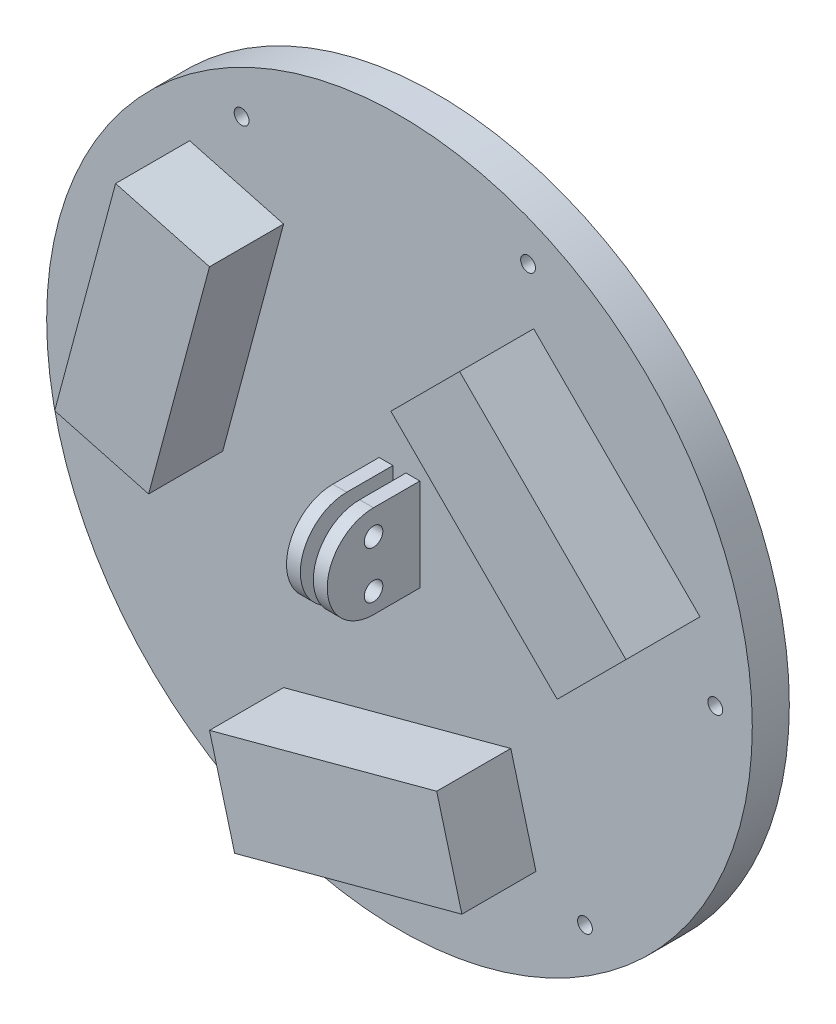
ISO-10303-21;
HEADER;
FILE_DESCRIPTION(('STEP AP214'),'2;1');
FILE_NAME('part.step','',(''),(''),'','','');
FILE_SCHEMA(('AUTOMOTIVE_DESIGN { 1 0 10303 214 1 1 1 1 }'));
ENDSEC;
DATA;
#1=APPLICATION_CONTEXT('core data for automotive mechanical design processes');
#2=APPLICATION_PROTOCOL_DEFINITION('international standard','automotive_design',2000,#1);
#3=PRODUCT_CONTEXT('',#1,'mechanical');
#4=PRODUCT('Part','Part','',(#3));
#5=PRODUCT_RELATED_PRODUCT_CATEGORY('part','',(#4));
#6=PRODUCT_DEFINITION_FORMATION('','',#4);
#7=PRODUCT_DEFINITION_CONTEXT('part definition',#1,'design');
#8=PRODUCT_DEFINITION('design','',#6,#7);
#9=PRODUCT_DEFINITION_SHAPE('','',#8);
#10=(LENGTH_UNIT() NAMED_UNIT(*) SI_UNIT(.MILLI.,.METRE.));
#11=(NAMED_UNIT(*) PLANE_ANGLE_UNIT() SI_UNIT($,.RADIAN.));
#12=(NAMED_UNIT(*) SI_UNIT($,.STERADIAN.) SOLID_ANGLE_UNIT());
#13=UNCERTAINTY_MEASURE_WITH_UNIT(LENGTH_MEASURE(1.E-05),#10,'distance_accuracy_value','');
#14=(GEOMETRIC_REPRESENTATION_CONTEXT(3) GLOBAL_UNCERTAINTY_ASSIGNED_CONTEXT((#13)) GLOBAL_UNIT_ASSIGNED_CONTEXT((#10,
#11,#12)) REPRESENTATION_CONTEXT('',''));
#15=CARTESIAN_POINT('',(0.,0.,0.));
#16=DIRECTION('',(0.,0.,1.));
#17=DIRECTION('',(1.,0.,0.));
#18=AXIS2_PLACEMENT_3D('',#15,#16,#17);
#19=CARTESIAN_POINT('',(0.,0.,4.));
#20=DIRECTION('',(0.,0.,1.));
#21=DIRECTION('',(1.,0.,0.));
#22=AXIS2_PLACEMENT_3D('',#19,#20,#21);
#23=PLANE('',#22);
#24=CARTESIAN_POINT('',(13.8867658683062,31.1443049965615,4.));
#25=DIRECTION('',(0.,0.,1.));
#26=DIRECTION('',(1.,0.,0.));
#27=AXIS2_PLACEMENT_3D('',#24,#25,#26);
#28=CIRCLE('',#27,0.800000000000001);
#29=CARTESIAN_POINT('',(14.6867658683062,31.1443049965615,4.));
#30=VERTEX_POINT('',#29);
#31=EDGE_CURVE('E922',#30,#30,#28,.T.);
#32=ORIENTED_EDGE('',*,*,#31,.F.);
#33=EDGE_LOOP('',(#32));
#34=FACE_BOUND('',#33,.T.);
#35=CARTESIAN_POINT('',(20.0283763760814,-27.5984445166405,4.));
#36=DIRECTION('',(0.,0.,1.));
#37=DIRECTION('',(1.,0.,0.));
#38=AXIS2_PLACEMENT_3D('',#35,#36,#37);
#39=CIRCLE('',#38,0.800000000000637);
#40=CARTESIAN_POINT('',(20.828376376082,-27.5984445166405,4.));
#41=VERTEX_POINT('',#40);
#42=EDGE_CURVE('E924',#41,#41,#39,.T.);
#43=ORIENTED_EDGE('',*,*,#42,.F.);
#44=EDGE_LOOP('',(#43));
#45=FACE_BOUND('',#44,.T.);
#46=CARTESIAN_POINT('',(-33.9151422443851,-3.54586047992216,4.));
#47=DIRECTION('',(0.,0.,1.));
#48=DIRECTION('',(1.,0.,0.));
#49=AXIS2_PLACEMENT_3D('',#46,#47,#48);
#50=CIRCLE('',#49,0.800000000001796);
#51=CARTESIAN_POINT('',(-33.1151422443833,-3.54586047992216,4.));
#52=VERTEX_POINT('',#51);
#53=EDGE_CURVE('E935',#52,#52,#50,.T.);
#54=ORIENTED_EDGE('',*,*,#53,.F.);
#55=EDGE_LOOP('',(#54));
#56=FACE_BOUND('',#55,.T.);
#57=CARTESIAN_POINT('',(0.,0.,4.));
#58=DIRECTION('',(0.,0.,1.));
#59=DIRECTION('',(1.,0.,0.));
#60=AXIS2_PLACEMENT_3D('',#57,#58,#59);
#61=CIRCLE('',#60,0.6);
#62=CARTESIAN_POINT('',(0.6,0.,4.));
#63=VERTEX_POINT('',#62);
#64=EDGE_CURVE('E408',#63,#63,#61,.T.);
#65=ORIENTED_EDGE('',*,*,#64,.F.);
#66=EDGE_LOOP('',(#65));
#67=FACE_BOUND('',#66,.T.);
#68=CARTESIAN_POINT('',(34.1000000000013,-0.0857218150126376,4.));
#69=DIRECTION('',(0.,0.,1.));
#70=DIRECTION('',(1.,0.,0.));
#71=AXIS2_PLACEMENT_3D('',#68,#69,#70);
#72=CIRCLE('',#71,0.800000000000003);
#73=CARTESIAN_POINT('',(34.9000000000013,-0.0857218150126376,4.));
#74=VERTEX_POINT('',#73);
#75=EDGE_CURVE('E413',#74,#74,#72,.T.);
#76=ORIENTED_EDGE('',*,*,#75,.F.);
#77=EDGE_LOOP('',(#76));
#78=FACE_BOUND('',#77,.T.);
#79=CARTESIAN_POINT('',(-17.0499999999986,-29.617188084062,4.));
#80=DIRECTION('',(0.,0.,1.));
#81=DIRECTION('',(1.,0.,0.));
#82=AXIS2_PLACEMENT_3D('',#79,#80,#81);
#83=CIRCLE('',#82,0.799999999999999);
#84=CARTESIAN_POINT('',(-16.2499999999986,-29.617188084062,4.));
#85=VERTEX_POINT('',#84);
#86=EDGE_CURVE('E418',#85,#85,#83,.T.);
#87=ORIENTED_EDGE('',*,*,#86,.F.);
#88=EDGE_LOOP('',(#87));
#89=FACE_BOUND('',#88,.T.);
#90=CARTESIAN_POINT('',(-17.0499999999987,29.4457444540367,4.));
#91=DIRECTION('',(0.,0.,1.));
#92=DIRECTION('',(1.,0.,0.));
#93=AXIS2_PLACEMENT_3D('',#90,#91,#92);
#94=CIRCLE('',#93,0.799999999999999);
#95=CARTESIAN_POINT('',(-16.2499999999986,29.4457444540367,4.));
#96=VERTEX_POINT('',#95);
#97=EDGE_CURVE('E422',#96,#96,#94,.T.);
#98=ORIENTED_EDGE('',*,*,#97,.F.);
#99=EDGE_LOOP('',(#98));
#100=FACE_BOUND('',#99,.T.);
#101=CARTESIAN_POINT('',(0.,0.,4.));
#102=DIRECTION('',(0.,0.,1.));
#103=DIRECTION('',(1.,0.,0.));
#104=AXIS2_PLACEMENT_3D('',#101,#102,#103);
#105=CIRCLE('',#104,38.1);
#106=CARTESIAN_POINT('',(38.1,0.,4.));
#107=VERTEX_POINT('',#106);
#108=EDGE_CURVE('E11',#107,#107,#105,.T.);
#109=ORIENTED_EDGE('',*,*,#108,.T.);
#110=EDGE_LOOP('',(#109));
#111=FACE_BOUND('',#110,.T.);
#112=DIRECTION('',(1.,0.,0.));
#113=VECTOR('',#112,1.);
#114=CARTESIAN_POINT('',(0.7,-5.,4.));
#115=LINE('',#114,#113);
#116=CARTESIAN_POINT('',(0.7,-5.,4.));
#117=VERTEX_POINT('',#116);
#118=CARTESIAN_POINT('',(2.2,-5.,4.));
#119=VERTEX_POINT('',#118);
#120=EDGE_CURVE('E384',#117,#119,#115,.T.);
#121=ORIENTED_EDGE('',*,*,#120,.F.);
#122=DIRECTION('',(0.,-1.,0.));
#123=VECTOR('',#122,1.);
#124=CARTESIAN_POINT('',(0.699999999999999,5.,4.));
#125=LINE('',#124,#123);
#126=CARTESIAN_POINT('',(0.699999999999999,5.,4.));
#127=VERTEX_POINT('',#126);
#128=EDGE_CURVE('E380',#127,#117,#125,.T.);
#129=ORIENTED_EDGE('',*,*,#128,.F.);
#130=DIRECTION('',(-1.,0.,0.));
#131=VECTOR('',#130,1.);
#132=CARTESIAN_POINT('',(0.699999999999999,5.,4.));
#133=LINE('',#132,#131);
#134=CARTESIAN_POINT('',(2.2,5.,4.));
#135=VERTEX_POINT('',#134);
#136=EDGE_CURVE('E392',#135,#127,#133,.T.);
#137=ORIENTED_EDGE('',*,*,#136,.F.);
#138=DIRECTION('',(0.,1.,0.));
#139=VECTOR('',#138,1.);
#140=CARTESIAN_POINT('',(2.2,5.,4.));
#141=LINE('',#140,#139);
#142=EDGE_CURVE('E388',#119,#135,#141,.T.);
#143=ORIENTED_EDGE('',*,*,#142,.F.);
#144=EDGE_LOOP('',(#121,#129,#137,#143));
#145=FACE_BOUND('',#144,.T.);
#146=DIRECTION('',(-1.,0.,0.));
#147=VECTOR('',#146,1.);
#148=CARTESIAN_POINT('',(-0.700000000000001,5.,4.));
#149=LINE('',#148,#147);
#150=CARTESIAN_POINT('',(-0.700000000000001,5.,4.));
#151=VERTEX_POINT('',#150);
#152=CARTESIAN_POINT('',(-2.2,5.,4.));
#153=VERTEX_POINT('',#152);
#154=EDGE_CURVE('E372',#151,#153,#149,.T.);
#155=ORIENTED_EDGE('',*,*,#154,.F.);
#156=DIRECTION('',(0.,1.,0.));
#157=VECTOR('',#156,1.);
#158=CARTESIAN_POINT('',(-0.700000000000001,5.,4.));
#159=LINE('',#158,#157);
#160=CARTESIAN_POINT('',(-0.7,-5.,4.));
#161=VERTEX_POINT('',#160);
#162=EDGE_CURVE('E376',#161,#151,#159,.T.);
#163=ORIENTED_EDGE('',*,*,#162,.F.);
#164=DIRECTION('',(1.,0.,0.));
#165=VECTOR('',#164,1.);
#166=CARTESIAN_POINT('',(-0.7,-5.,4.));
#167=LINE('',#166,#165);
#168=CARTESIAN_POINT('',(-2.2,-5.,4.));
#169=VERTEX_POINT('',#168);
#170=EDGE_CURVE('E364',#169,#161,#167,.T.);
#171=ORIENTED_EDGE('',*,*,#170,.F.);
#172=DIRECTION('',(0.,-1.,0.));
#173=VECTOR('',#172,1.);
#174=CARTESIAN_POINT('',(-2.2,5.,4.));
#175=LINE('',#174,#173);
#176=EDGE_CURVE('E368',#153,#169,#175,.T.);
#177=ORIENTED_EDGE('',*,*,#176,.F.);
#178=EDGE_LOOP('',(#155,#163,#171,#177));
#179=FACE_BOUND('',#178,.T.);
#180=DIRECTION('',(0.707106781186546,0.707106781186549,0.));
#181=VECTOR('',#180,1.);
#182=CARTESIAN_POINT('',(25.0287924547002,0.,4.));
#183=LINE('',#182,#181);
#184=CARTESIAN_POINT('',(25.0287924547002,0.,4.));
#185=VERTEX_POINT('',#184);
#186=CARTESIAN_POINT('',(32.4534136571589,7.42462120245876,4.));
#187=VERTEX_POINT('',#186);
#188=EDGE_CURVE('E281',#185,#187,#183,.T.);
#189=ORIENTED_EDGE('',*,*,#188,.F.);
#190=DIRECTION('',(0.707106781186549,-0.707106781186546,0.));
#191=VECTOR('',#190,1.);
#192=CARTESIAN_POINT('',(25.0287924547002,0.,4.));
#193=LINE('',#192,#191);
#194=CARTESIAN_POINT('',(7.06828021256182,17.9605122421383,4.));
#195=VERTEX_POINT('',#194);
#196=EDGE_CURVE('E251',#195,#185,#193,.T.);
#197=ORIENTED_EDGE('',*,*,#196,.F.);
#198=DIRECTION('',(-0.707106781186546,-0.707106781186549,0.));
#199=VECTOR('',#198,1.);
#200=CARTESIAN_POINT('',(7.06828021256182,17.9605122421383,4.));
#201=LINE('',#200,#199);
#202=CARTESIAN_POINT('',(14.4929014150206,25.385133444597,4.));
#203=VERTEX_POINT('',#202);
#204=EDGE_CURVE('E268',#203,#195,#201,.T.);
#205=ORIENTED_EDGE('',*,*,#204,.F.);
#206=DIRECTION('',(-0.707106781186549,0.707106781186546,0.));
#207=VECTOR('',#206,1.);
#208=CARTESIAN_POINT('',(32.4534136571589,7.42462120245876,4.));
#209=LINE('',#208,#207);
#210=EDGE_CURVE('E284',#187,#203,#209,.T.);
#211=ORIENTED_EDGE('',*,*,#210,.F.);
#212=EDGE_LOOP('',(#189,#197,#205,#211));
#213=FACE_BOUND('',#212,.T.);
#214=DIRECTION('',(0.258819045102518,-0.965925826289069,0.));
#215=VECTOR('',#214,1.);
#216=CARTESIAN_POINT('',(-12.5143962273502,-21.6755700918186,4.));
#217=LINE('',#216,#215);
#218=CARTESIAN_POINT('',(-12.5143962273502,-21.6755700918186,4.));
#219=VERTEX_POINT('',#218);
#220=CARTESIAN_POINT('',(-9.79679625377374,-31.8177912678538,4.));
#221=VERTEX_POINT('',#220);
#222=EDGE_CURVE('E244',#219,#221,#217,.T.);
#223=ORIENTED_EDGE('',*,*,#222,.F.);
#224=DIRECTION('',(-0.965925826289069,-0.258819045102518,0.));
#225=VECTOR('',#224,1.);
#226=CARTESIAN_POINT('',(-12.5143962273502,-21.6755700918186,4.));
#227=LINE('',#226,#225);
#228=CARTESIAN_POINT('',(12.0201197603922,-15.1015663462146,4.));
#229=VERTEX_POINT('',#228);
#230=EDGE_CURVE('E247',#229,#219,#227,.T.);
#231=ORIENTED_EDGE('',*,*,#230,.F.);
#232=DIRECTION('',(-0.258819045102518,0.965925826289069,0.));
#233=VECTOR('',#232,1.);
#234=CARTESIAN_POINT('',(12.0201197603922,-15.1015663462146,4.));
#235=LINE('',#234,#233);
#236=CARTESIAN_POINT('',(14.7377197339686,-25.2437875222498,4.));
#237=VERTEX_POINT('',#236);
#238=EDGE_CURVE('E237',#237,#229,#235,.T.);
#239=ORIENTED_EDGE('',*,*,#238,.F.);
#240=DIRECTION('',(0.965925826289069,0.258819045102518,0.));
#241=VECTOR('',#240,1.);
#242=CARTESIAN_POINT('',(-9.79679625377374,-31.8177912678538,4.));
#243=LINE('',#242,#241);
#244=EDGE_CURVE('E240',#221,#237,#243,.T.);
#245=ORIENTED_EDGE('',*,*,#244,.F.);
#246=EDGE_LOOP('',(#223,#231,#239,#245));
#247=FACE_BOUND('',#246,.T.);
#248=DIRECTION('',(-0.965925826289066,0.258819045102528,0.));
#249=VECTOR('',#248,1.);
#250=CARTESIAN_POINT('',(-12.5143962273499,21.6755700918187,4.));
#251=LINE('',#250,#249);
#252=CARTESIAN_POINT('',(-12.5143962273499,21.6755700918187,4.));
#253=VERTEX_POINT('',#252);
#254=CARTESIAN_POINT('',(-22.6566174033851,24.3931700653953,4.));
#255=VERTEX_POINT('',#254);
#256=EDGE_CURVE('E206',#253,#255,#251,.T.);
#257=ORIENTED_EDGE('',*,*,#256,.F.);
#258=DIRECTION('',(0.258819045102528,0.965925826289066,0.));
#259=VECTOR('',#258,1.);
#260=CARTESIAN_POINT('',(-12.5143962273499,21.6755700918187,4.));
#261=LINE('',#260,#259);
#262=CARTESIAN_POINT('',(-19.0883999729541,-2.85894589592355,4.));
#263=VERTEX_POINT('',#262);
#264=EDGE_CURVE('E200',#263,#253,#261,.T.);
#265=ORIENTED_EDGE('',*,*,#264,.F.);
#266=DIRECTION('',(0.965925826289066,-0.258819045102528,0.));
#267=VECTOR('',#266,1.);
#268=CARTESIAN_POINT('',(-19.0883999729541,-2.85894589592355,4.));
#269=LINE('',#268,#267);
#270=CARTESIAN_POINT('',(-29.2306211489893,-0.141345922347008,4.));
#271=VERTEX_POINT('',#270);
#272=EDGE_CURVE('E184',#271,#263,#269,.T.);
#273=ORIENTED_EDGE('',*,*,#272,.F.);
#274=DIRECTION('',(-0.258819045102528,-0.965925826289066,0.));
#275=VECTOR('',#274,1.);
#276=CARTESIAN_POINT('',(-22.6566174033851,24.3931700653953,4.));
#277=LINE('',#276,#275);
#278=EDGE_CURVE('E193',#255,#271,#277,.T.);
#279=ORIENTED_EDGE('',*,*,#278,.F.);
#280=EDGE_LOOP('',(#257,#265,#273,#279));
#281=FACE_BOUND('',#280,.T.);
#282=ADVANCED_FACE('F43',(#34,#45,#56,#67,#78,#89,#100,#111,#145,#179,#213,#247,#281),#23,.T.);
#283=CARTESIAN_POINT('',(0.699999999999999,5.,14.));
#284=DIRECTION('',(1.,0.,0.));
#285=DIRECTION('',(0.,1.,0.));
#286=AXIS2_PLACEMENT_3D('',#283,#284,#285);
#287=PLANE('',#286);
#288=CARTESIAN_POINT('',(0.699999999999999,2.3,9.));
#289=DIRECTION('',(1.,0.,0.));
#290=DIRECTION('',(0.,1.,0.));
#291=AXIS2_PLACEMENT_3D('',#288,#289,#290);
#292=CIRCLE('',#291,1.);
#293=CARTESIAN_POINT('',(0.699999999999999,3.3,9.));
#294=VERTEX_POINT('',#293);
#295=EDGE_CURVE('E324',#294,#294,#292,.T.);
#296=ORIENTED_EDGE('',*,*,#295,.T.);
#297=EDGE_LOOP('',(#296));
#298=FACE_BOUND('',#297,.T.);
#299=CARTESIAN_POINT('',(0.699999999999999,-2.8,9.));
#300=DIRECTION('',(1.,0.,0.));
#301=DIRECTION('',(0.,1.,0.));
#302=AXIS2_PLACEMENT_3D('',#299,#300,#301);
#303=CIRCLE('',#302,1.);
#304=CARTESIAN_POINT('',(0.699999999999999,-1.8,9.));
#305=VERTEX_POINT('',#304);
#306=EDGE_CURVE('E316',#305,#305,#303,.T.);
#307=ORIENTED_EDGE('',*,*,#306,.T.);
#308=EDGE_LOOP('',(#307));
#309=FACE_BOUND('',#308,.T.);
#310=DIRECTION('',(0.,0.,-1.));
#311=VECTOR('',#310,1.);
#312=CARTESIAN_POINT('',(0.7,-5.,14.));
#313=LINE('',#312,#311);
#314=CARTESIAN_POINT('',(0.699999999999999,-5.,9.));
#315=VERTEX_POINT('',#314);
#316=EDGE_CURVE('E405',#315,#117,#313,.T.);
#317=ORIENTED_EDGE('',*,*,#316,.F.);
#318=CARTESIAN_POINT('',(0.699999999999999,0.,9.));
#319=DIRECTION('',(1.,0.,0.));
#320=DIRECTION('',(0.,1.,0.));
#321=AXIS2_PLACEMENT_3D('',#318,#319,#320);
#322=CIRCLE('',#321,5.);
#323=CARTESIAN_POINT('',(0.699999999999999,5.,9.));
#324=VERTEX_POINT('',#323);
#325=EDGE_CURVE('E348',#315,#324,#322,.F.);
#326=ORIENTED_EDGE('',*,*,#325,.T.);
#327=DIRECTION('',(0.,0.,-1.));
#328=VECTOR('',#327,1.);
#329=CARTESIAN_POINT('',(0.699999999999999,5.,14.));
#330=LINE('',#329,#328);
#331=EDGE_CURVE('E396',#324,#127,#330,.T.);
#332=ORIENTED_EDGE('',*,*,#331,.T.);
#333=ORIENTED_EDGE('',*,*,#128,.T.);
#334=EDGE_LOOP('',(#317,#326,#332,#333));
#335=FACE_BOUND('',#334,.T.);
#336=ADVANCED_FACE('F504',(#298,#309,#335),#287,.F.);
#337=CARTESIAN_POINT('',(2.2,5.,14.));
#338=DIRECTION('',(-1.,0.,0.));
#339=DIRECTION('',(0.,0.,1.));
#340=AXIS2_PLACEMENT_3D('',#337,#338,#339);
#341=PLANE('',#340);
#342=CARTESIAN_POINT('',(2.2,2.3,9.));
#343=DIRECTION('',(1.,0.,0.));
#344=DIRECTION('',(0.,1.,0.));
#345=AXIS2_PLACEMENT_3D('',#342,#343,#344);
#346=CIRCLE('',#345,1.);
#347=CARTESIAN_POINT('',(2.2,3.3,9.));
#348=VERTEX_POINT('',#347);
#349=EDGE_CURVE('E304',#348,#348,#346,.T.);
#350=ORIENTED_EDGE('',*,*,#349,.F.);
#351=EDGE_LOOP('',(#350));
#352=FACE_BOUND('',#351,.T.);
#353=CARTESIAN_POINT('',(2.2,-2.8,9.));
#354=DIRECTION('',(1.,0.,0.));
#355=DIRECTION('',(0.,1.,0.));
#356=AXIS2_PLACEMENT_3D('',#353,#354,#355);
#357=CIRCLE('',#356,1.);
#358=CARTESIAN_POINT('',(2.2,-1.8,9.));
#359=VERTEX_POINT('',#358);
#360=EDGE_CURVE('E303',#359,#359,#357,.T.);
#361=ORIENTED_EDGE('',*,*,#360,.F.);
#362=EDGE_LOOP('',(#361));
#363=FACE_BOUND('',#362,.T.);
#364=CARTESIAN_POINT('',(2.2,0.,9.));
#365=DIRECTION('',(1.,0.,0.));
#366=DIRECTION('',(0.,1.,0.));
#367=AXIS2_PLACEMENT_3D('',#364,#365,#366);
#368=CIRCLE('',#367,5.);
#369=CARTESIAN_POINT('',(2.2,-5.,9.));
#370=VERTEX_POINT('',#369);
#371=CARTESIAN_POINT('',(2.2,5.,9.));
#372=VERTEX_POINT('',#371);
#373=EDGE_CURVE('E333',#370,#372,#368,.F.);
#374=ORIENTED_EDGE('',*,*,#373,.F.);
#375=DIRECTION('',(0.,0.,-1.));
#376=VECTOR('',#375,1.);
#377=CARTESIAN_POINT('',(2.2,-5.,14.));
#378=LINE('',#377,#376);
#379=EDGE_CURVE('E402',#370,#119,#378,.T.);
#380=ORIENTED_EDGE('',*,*,#379,.T.);
#381=ORIENTED_EDGE('',*,*,#142,.T.);
#382=DIRECTION('',(0.,0.,-1.));
#383=VECTOR('',#382,1.);
#384=CARTESIAN_POINT('',(2.2,5.,14.));
#385=LINE('',#384,#383);
#386=EDGE_CURVE('E399',#372,#135,#385,.T.);
#387=ORIENTED_EDGE('',*,*,#386,.F.);
#388=EDGE_LOOP('',(#374,#380,#381,#387));
#389=FACE_BOUND('',#388,.T.);
#390=ADVANCED_FACE('F461',(#352,#363,#389),#341,.F.);
#391=CARTESIAN_POINT('',(-0.700000000000001,5.,14.));
#392=DIRECTION('',(-1.,0.,0.));
#393=DIRECTION('',(0.,-1.,0.));
#394=AXIS2_PLACEMENT_3D('',#391,#392,#393);
#395=PLANE('',#394);
#396=CARTESIAN_POINT('',(-0.699999999999999,2.3,9.));
#397=DIRECTION('',(-1.,0.,0.));
#398=DIRECTION('',(0.,-1.,0.));
#399=AXIS2_PLACEMENT_3D('',#396,#397,#398);
#400=CIRCLE('',#399,1.);
#401=CARTESIAN_POINT('',(-0.699999999999999,1.3,9.));
#402=VERTEX_POINT('',#401);
#403=EDGE_CURVE('E320',#402,#402,#400,.T.);
#404=ORIENTED_EDGE('',*,*,#403,.T.);
#405=EDGE_LOOP('',(#404));
#406=FACE_BOUND('',#405,.T.);
#407=CARTESIAN_POINT('',(-0.699999999999999,-2.8,9.));
#408=DIRECTION('',(-1.,0.,0.));
#409=DIRECTION('',(0.,-1.,0.));
#410=AXIS2_PLACEMENT_3D('',#407,#408,#409);
#411=CIRCLE('',#410,1.);
#412=CARTESIAN_POINT('',(-0.699999999999999,-3.8,9.));
#413=VERTEX_POINT('',#412);
#414=EDGE_CURVE('E312',#413,#413,#411,.T.);
#415=ORIENTED_EDGE('',*,*,#414,.T.);
#416=EDGE_LOOP('',(#415));
#417=FACE_BOUND('',#416,.T.);
#418=CARTESIAN_POINT('',(-0.699999999999999,0.,9.));
#419=DIRECTION('',(-1.,0.,0.));
#420=DIRECTION('',(0.,-1.,0.));
#421=AXIS2_PLACEMENT_3D('',#418,#419,#420);
#422=CIRCLE('',#421,5.);
#423=CARTESIAN_POINT('',(-0.699999999999999,5.,9.));
#424=VERTEX_POINT('',#423);
#425=CARTESIAN_POINT('',(-0.699999999999999,-5.,9.));
#426=VERTEX_POINT('',#425);
#427=EDGE_CURVE('E345',#424,#426,#422,.F.);
#428=ORIENTED_EDGE('',*,*,#427,.T.);
#429=DIRECTION('',(0.,0.,-1.));
#430=VECTOR('',#429,1.);
#431=CARTESIAN_POINT('',(-0.7,-5.,14.));
#432=LINE('',#431,#430);
#433=EDGE_CURVE('E361',#426,#161,#432,.T.);
#434=ORIENTED_EDGE('',*,*,#433,.T.);
#435=ORIENTED_EDGE('',*,*,#162,.T.);
#436=DIRECTION('',(0.,0.,-1.));
#437=VECTOR('',#436,1.);
#438=CARTESIAN_POINT('',(-0.700000000000001,5.,14.));
#439=LINE('',#438,#437);
#440=EDGE_CURVE('E352',#424,#151,#439,.T.);
#441=ORIENTED_EDGE('',*,*,#440,.F.);
#442=EDGE_LOOP('',(#428,#434,#435,#441));
#443=FACE_BOUND('',#442,.T.);
#444=ADVANCED_FACE('F458',(#406,#417,#443),#395,.F.);
#445=CARTESIAN_POINT('',(-2.2,5.,14.));
#446=DIRECTION('',(1.,0.,0.));
#447=DIRECTION('',(0.,1.,0.));
#448=AXIS2_PLACEMENT_3D('',#445,#446,#447);
#449=PLANE('',#448);
#450=CARTESIAN_POINT('',(-2.2,2.3,9.));
#451=DIRECTION('',(1.,0.,0.));
#452=DIRECTION('',(0.,1.,0.));
#453=AXIS2_PLACEMENT_3D('',#450,#451,#452);
#454=CIRCLE('',#453,1.);
#455=CARTESIAN_POINT('',(-2.2,3.3,9.));
#456=VERTEX_POINT('',#455);
#457=EDGE_CURVE('E47',#456,#456,#454,.T.);
#458=ORIENTED_EDGE('',*,*,#457,.T.);
#459=EDGE_LOOP('',(#458));
#460=FACE_BOUND('',#459,.T.);
#461=CARTESIAN_POINT('',(-2.2,-2.8,9.));
#462=DIRECTION('',(1.,0.,0.));
#463=DIRECTION('',(0.,1.,0.));
#464=AXIS2_PLACEMENT_3D('',#461,#462,#463);
#465=CIRCLE('',#464,1.);
#466=CARTESIAN_POINT('',(-2.2,-1.8,9.));
#467=VERTEX_POINT('',#466);
#468=EDGE_CURVE('E308',#467,#467,#465,.T.);
#469=ORIENTED_EDGE('',*,*,#468,.T.);
#470=EDGE_LOOP('',(#469));
#471=FACE_BOUND('',#470,.T.);
#472=DIRECTION('',(0.,0.,-1.));
#473=VECTOR('',#472,1.);
#474=CARTESIAN_POINT('',(-2.2,-5.,14.));
#475=LINE('',#474,#473);
#476=CARTESIAN_POINT('',(-2.2,-5.,9.));
#477=VERTEX_POINT('',#476);
#478=EDGE_CURVE('E358',#477,#169,#475,.T.);
#479=ORIENTED_EDGE('',*,*,#478,.F.);
#480=CARTESIAN_POINT('',(-2.2,0.,9.));
#481=DIRECTION('',(1.,0.,0.));
#482=DIRECTION('',(0.,1.,0.));
#483=AXIS2_PLACEMENT_3D('',#480,#481,#482);
#484=CIRCLE('',#483,5.);
#485=CARTESIAN_POINT('',(-2.2,5.,9.));
#486=VERTEX_POINT('',#485);
#487=EDGE_CURVE('E341',#477,#486,#484,.F.);
#488=ORIENTED_EDGE('',*,*,#487,.T.);
#489=DIRECTION('',(0.,0.,-1.));
#490=VECTOR('',#489,1.);
#491=CARTESIAN_POINT('',(-2.2,5.,14.));
#492=LINE('',#491,#490);
#493=EDGE_CURVE('E355',#486,#153,#492,.T.);
#494=ORIENTED_EDGE('',*,*,#493,.T.);
#495=ORIENTED_EDGE('',*,*,#176,.T.);
#496=EDGE_LOOP('',(#479,#488,#494,#495));
#497=FACE_BOUND('',#496,.T.);
#498=ADVANCED_FACE('F446',(#460,#471,#497),#449,.F.);
#499=CARTESIAN_POINT('',(0.699999999999999,5.,14.));
#500=DIRECTION('',(0.,-1.,0.));
#501=DIRECTION('',(0.,0.,-1.));
#502=AXIS2_PLACEMENT_3D('',#499,#500,#501);
#503=PLANE('',#502);
#504=DIRECTION('',(1.,0.,0.));
#505=VECTOR('',#504,1.);
#506=CARTESIAN_POINT('',(-38.1,4.99999999999999,9.));
#507=LINE('',#506,#505);
#508=EDGE_CURVE('E336',#324,#372,#507,.T.);
#509=ORIENTED_EDGE('',*,*,#508,.T.);
#510=ORIENTED_EDGE('',*,*,#386,.T.);
#511=ORIENTED_EDGE('',*,*,#136,.T.);
#512=ORIENTED_EDGE('',*,*,#331,.F.);
#513=EDGE_LOOP('',(#509,#510,#511,#512));
#514=FACE_BOUND('',#513,.T.);
#515=ADVANCED_FACE('F571',(#514),#503,.F.);
#516=CARTESIAN_POINT('',(-0.700000000000001,5.,14.));
#517=DIRECTION('',(0.,-1.,0.));
#518=DIRECTION('',(0.,0.,-1.));
#519=AXIS2_PLACEMENT_3D('',#516,#517,#518);
#520=PLANE('',#519);
#521=EDGE_CURVE('E340',#486,#424,#507,.T.);
#522=ORIENTED_EDGE('',*,*,#521,.T.);
#523=ORIENTED_EDGE('',*,*,#440,.T.);
#524=ORIENTED_EDGE('',*,*,#154,.T.);
#525=ORIENTED_EDGE('',*,*,#493,.F.);
#526=EDGE_LOOP('',(#522,#523,#524,#525));
#527=FACE_BOUND('',#526,.T.);
#528=ADVANCED_FACE('F483',(#527),#520,.F.);
#529=CARTESIAN_POINT('',(0.,0.,4.));
#530=DIRECTION('',(0.,0.,-1.));
#531=DIRECTION('',(-1.,0.,0.));
#532=AXIS2_PLACEMENT_3D('',#529,#530,#531);
#533=CYLINDRICAL_SURFACE('',#532,38.1);
#534=ORIENTED_EDGE('',*,*,#108,.F.);
#535=EDGE_LOOP('',(#534));
#536=FACE_BOUND('',#535,.T.);
#537=CARTESIAN_POINT('',(0.,0.,0.));
#538=DIRECTION('',(0.,0.,1.));
#539=DIRECTION('',(1.,0.,0.));
#540=AXIS2_PLACEMENT_3D('',#537,#538,#539);
#541=CIRCLE('',#540,38.1);
#542=CARTESIAN_POINT('',(38.1,0.,0.));
#543=VERTEX_POINT('',#542);
#544=EDGE_CURVE('E53',#543,#543,#541,.T.);
#545=ORIENTED_EDGE('',*,*,#544,.T.);
#546=EDGE_LOOP('',(#545));
#547=FACE_BOUND('',#546,.T.);
#548=ADVANCED_FACE('F45',(#536,#547),#533,.T.);
#549=CARTESIAN_POINT('',(0.,0.,0.));
#550=DIRECTION('',(0.,0.,1.));
#551=DIRECTION('',(1.,0.,0.));
#552=AXIS2_PLACEMENT_3D('',#549,#550,#551);
#553=PLANE('',#552);
#554=CARTESIAN_POINT('',(13.8867658683062,31.1443049965615,0.));
#555=DIRECTION('',(0.,0.,1.));
#556=DIRECTION('',(1.,0.,0.));
#557=AXIS2_PLACEMENT_3D('',#554,#555,#556);
#558=CIRCLE('',#557,0.800000000000001);
#559=CARTESIAN_POINT('',(14.6867658683062,31.1443049965615,0.));
#560=VERTEX_POINT('',#559);
#561=EDGE_CURVE('E530',#560,#560,#558,.T.);
#562=ORIENTED_EDGE('',*,*,#561,.T.);
#563=EDGE_LOOP('',(#562));
#564=FACE_BOUND('',#563,.T.);
#565=CARTESIAN_POINT('',(20.0283763760814,-27.5984445166405,0.));
#566=DIRECTION('',(0.,0.,1.));
#567=DIRECTION('',(1.,0.,0.));
#568=AXIS2_PLACEMENT_3D('',#565,#566,#567);
#569=CIRCLE('',#568,0.800000000000637);
#570=CARTESIAN_POINT('',(20.828376376082,-27.5984445166405,0.));
#571=VERTEX_POINT('',#570);
#572=EDGE_CURVE('E534',#571,#571,#569,.T.);
#573=ORIENTED_EDGE('',*,*,#572,.T.);
#574=EDGE_LOOP('',(#573));
#575=FACE_BOUND('',#574,.T.);
#576=CARTESIAN_POINT('',(-33.9151422443851,-3.54586047992216,0.));
#577=DIRECTION('',(0.,0.,1.));
#578=DIRECTION('',(1.,0.,0.));
#579=AXIS2_PLACEMENT_3D('',#576,#577,#578);
#580=CIRCLE('',#579,0.800000000001796);
#581=CARTESIAN_POINT('',(-33.1151422443833,-3.54586047992216,0.));
#582=VERTEX_POINT('',#581);
#583=EDGE_CURVE('E538',#582,#582,#580,.T.);
#584=ORIENTED_EDGE('',*,*,#583,.T.);
#585=EDGE_LOOP('',(#584));
#586=FACE_BOUND('',#585,.T.);
#587=CARTESIAN_POINT('',(0.,0.,0.));
#588=DIRECTION('',(0.,0.,1.));
#589=DIRECTION('',(1.,0.,0.));
#590=AXIS2_PLACEMENT_3D('',#587,#588,#589);
#591=CIRCLE('',#590,0.6);
#592=CARTESIAN_POINT('',(0.6,0.,0.));
#593=VERTEX_POINT('',#592);
#594=EDGE_CURVE('E412',#593,#593,#591,.T.);
#595=ORIENTED_EDGE('',*,*,#594,.T.);
#596=EDGE_LOOP('',(#595));
#597=FACE_BOUND('',#596,.T.);
#598=CARTESIAN_POINT('',(34.1000000000013,-0.0857218150126376,0.));
#599=DIRECTION('',(0.,0.,1.));
#600=DIRECTION('',(1.,0.,0.));
#601=AXIS2_PLACEMENT_3D('',#598,#599,#600);
#602=CIRCLE('',#601,0.800000000000003);
#603=CARTESIAN_POINT('',(34.9000000000013,-0.0857218150126376,0.));
#604=VERTEX_POINT('',#603);
#605=EDGE_CURVE('E429',#604,#604,#602,.T.);
#606=ORIENTED_EDGE('',*,*,#605,.T.);
#607=EDGE_LOOP('',(#606));
#608=FACE_BOUND('',#607,.T.);
#609=CARTESIAN_POINT('',(-17.0499999999986,-29.617188084062,0.));
#610=DIRECTION('',(0.,0.,1.));
#611=DIRECTION('',(1.,0.,0.));
#612=AXIS2_PLACEMENT_3D('',#609,#610,#611);
#613=CIRCLE('',#612,0.799999999999999);
#614=CARTESIAN_POINT('',(-16.2499999999986,-29.617188084062,0.));
#615=VERTEX_POINT('',#614);
#616=EDGE_CURVE('E433',#615,#615,#613,.T.);
#617=ORIENTED_EDGE('',*,*,#616,.T.);
#618=EDGE_LOOP('',(#617));
#619=FACE_BOUND('',#618,.T.);
#620=CARTESIAN_POINT('',(-17.0499999999987,29.4457444540367,0.));
#621=DIRECTION('',(0.,0.,1.));
#622=DIRECTION('',(1.,0.,0.));
#623=AXIS2_PLACEMENT_3D('',#620,#621,#622);
#624=CIRCLE('',#623,0.799999999999999);
#625=CARTESIAN_POINT('',(-16.2499999999986,29.4457444540367,0.));
#626=VERTEX_POINT('',#625);
#627=EDGE_CURVE('E417',#626,#626,#624,.T.);
#628=ORIENTED_EDGE('',*,*,#627,.T.);
#629=EDGE_LOOP('',(#628));
#630=FACE_BOUND('',#629,.T.);
#631=ORIENTED_EDGE('',*,*,#544,.F.);
#632=EDGE_LOOP('',(#631));
#633=FACE_BOUND('',#632,.T.);
#634=ADVANCED_FACE('F517',(#564,#575,#586,#597,#608,#619,#630,#633),#553,.F.);
#635=CARTESIAN_POINT('',(-17.0499999999987,29.4457444540367,-2.));
#636=DIRECTION('',(0.,0.,1.));
#637=DIRECTION('',(1.,0.,0.));
#638=AXIS2_PLACEMENT_3D('',#635,#636,#637);
#639=CYLINDRICAL_SURFACE('',#638,0.799999999999999);
#640=ORIENTED_EDGE('',*,*,#97,.T.);
#641=EDGE_LOOP('',(#640));
#642=FACE_BOUND('',#641,.T.);
#643=ORIENTED_EDGE('',*,*,#627,.F.);
#644=EDGE_LOOP('',(#643));
#645=FACE_BOUND('',#644,.T.);
#646=ADVANCED_FACE('F515',(#642,#645),#639,.F.);
#647=CARTESIAN_POINT('',(-17.0499999999986,-29.617188084062,-2.));
#648=DIRECTION('',(0.,0.,1.));
#649=DIRECTION('',(1.,0.,0.));
#650=AXIS2_PLACEMENT_3D('',#647,#648,#649);
#651=CYLINDRICAL_SURFACE('',#650,0.799999999999999);
#652=ORIENTED_EDGE('',*,*,#86,.T.);
#653=EDGE_LOOP('',(#652));
#654=FACE_BOUND('',#653,.T.);
#655=ORIENTED_EDGE('',*,*,#616,.F.);
#656=EDGE_LOOP('',(#655));
#657=FACE_BOUND('',#656,.T.);
#658=ADVANCED_FACE('F524',(#654,#657),#651,.F.);
#659=CARTESIAN_POINT('',(34.1000000000013,-0.0857218150126376,-2.));
#660=DIRECTION('',(0.,0.,1.));
#661=DIRECTION('',(1.,0.,0.));
#662=AXIS2_PLACEMENT_3D('',#659,#660,#661);
#663=CYLINDRICAL_SURFACE('',#662,0.800000000000003);
#664=ORIENTED_EDGE('',*,*,#75,.T.);
#665=EDGE_LOOP('',(#664));
#666=FACE_BOUND('',#665,.T.);
#667=ORIENTED_EDGE('',*,*,#605,.F.);
#668=EDGE_LOOP('',(#667));
#669=FACE_BOUND('',#668,.T.);
#670=ADVANCED_FACE('F552',(#666,#669),#663,.F.);
#671=CARTESIAN_POINT('',(0.,0.,-2.));
#672=DIRECTION('',(0.,0.,1.));
#673=DIRECTION('',(1.,0.,0.));
#674=AXIS2_PLACEMENT_3D('',#671,#672,#673);
#675=CYLINDRICAL_SURFACE('',#674,0.6);
#676=ORIENTED_EDGE('',*,*,#64,.T.);
#677=EDGE_LOOP('',(#676));
#678=FACE_BOUND('',#677,.T.);
#679=ORIENTED_EDGE('',*,*,#594,.F.);
#680=EDGE_LOOP('',(#679));
#681=FACE_BOUND('',#680,.T.);
#682=ADVANCED_FACE('F557',(#678,#681),#675,.F.);
#683=CARTESIAN_POINT('',(0.7,-5.,14.));
#684=DIRECTION('',(0.,1.,0.));
#685=DIRECTION('',(-1.,0.,0.));
#686=AXIS2_PLACEMENT_3D('',#683,#684,#685);
#687=PLANE('',#686);
#688=ORIENTED_EDGE('',*,*,#379,.F.);
#689=DIRECTION('',(1.,0.,0.));
#690=VECTOR('',#689,1.);
#691=CARTESIAN_POINT('',(-38.1,-5.00000000000001,9.));
#692=LINE('',#691,#690);
#693=EDGE_CURVE('E328',#315,#370,#692,.T.);
#694=ORIENTED_EDGE('',*,*,#693,.F.);
#695=ORIENTED_EDGE('',*,*,#316,.T.);
#696=ORIENTED_EDGE('',*,*,#120,.T.);
#697=EDGE_LOOP('',(#688,#694,#695,#696));
#698=FACE_BOUND('',#697,.T.);
#699=ADVANCED_FACE('F562',(#698),#687,.F.);
#700=CARTESIAN_POINT('',(-0.7,-5.,14.));
#701=DIRECTION('',(0.,1.,0.));
#702=DIRECTION('',(0.,0.,1.));
#703=AXIS2_PLACEMENT_3D('',#700,#701,#702);
#704=PLANE('',#703);
#705=ORIENTED_EDGE('',*,*,#433,.F.);
#706=EDGE_CURVE('E332',#477,#426,#692,.T.);
#707=ORIENTED_EDGE('',*,*,#706,.F.);
#708=ORIENTED_EDGE('',*,*,#478,.T.);
#709=ORIENTED_EDGE('',*,*,#170,.T.);
#710=EDGE_LOOP('',(#705,#707,#708,#709));
#711=FACE_BOUND('',#710,.T.);
#712=ADVANCED_FACE('F474',(#711),#704,.F.);
#713=CARTESIAN_POINT('',(-38.1,0.,9.));
#714=DIRECTION('',(1.,0.,0.));
#715=DIRECTION('',(0.,1.,0.));
#716=AXIS2_PLACEMENT_3D('',#713,#714,#715);
#717=CYLINDRICAL_SURFACE('',#716,5.);
#718=ORIENTED_EDGE('',*,*,#521,.F.);
#719=ORIENTED_EDGE('',*,*,#487,.F.);
#720=ORIENTED_EDGE('',*,*,#706,.T.);
#721=ORIENTED_EDGE('',*,*,#427,.F.);
#722=EDGE_LOOP('',(#718,#719,#720,#721));
#723=FACE_BOUND('',#722,.T.);
#724=ADVANCED_FACE('F470',(#723),#717,.T.);
#725=ORIENTED_EDGE('',*,*,#325,.F.);
#726=ORIENTED_EDGE('',*,*,#693,.T.);
#727=ORIENTED_EDGE('',*,*,#373,.T.);
#728=ORIENTED_EDGE('',*,*,#508,.F.);
#729=EDGE_LOOP('',(#725,#726,#727,#728));
#730=FACE_BOUND('',#729,.T.);
#731=ADVANCED_FACE('F453',(#730),#717,.T.);
#732=CARTESIAN_POINT('',(-38.1,-2.80000000000001,9.));
#733=DIRECTION('',(1.,0.,0.));
#734=DIRECTION('',(0.,1.,0.));
#735=AXIS2_PLACEMENT_3D('',#732,#733,#734);
#736=CYLINDRICAL_SURFACE('',#735,1.);
#737=ORIENTED_EDGE('',*,*,#468,.F.);
#738=EDGE_LOOP('',(#737));
#739=FACE_BOUND('',#738,.T.);
#740=ORIENTED_EDGE('',*,*,#414,.F.);
#741=EDGE_LOOP('',(#740));
#742=FACE_BOUND('',#741,.T.);
#743=ADVANCED_FACE('F449',(#739,#742),#736,.F.);
#744=CARTESIAN_POINT('',(-38.1,2.29999999999999,9.));
#745=DIRECTION('',(1.,0.,0.));
#746=DIRECTION('',(0.,1.,0.));
#747=AXIS2_PLACEMENT_3D('',#744,#745,#746);
#748=CYLINDRICAL_SURFACE('',#747,1.);
#749=ORIENTED_EDGE('',*,*,#457,.F.);
#750=EDGE_LOOP('',(#749));
#751=FACE_BOUND('',#750,.T.);
#752=ORIENTED_EDGE('',*,*,#403,.F.);
#753=EDGE_LOOP('',(#752));
#754=FACE_BOUND('',#753,.T.);
#755=ADVANCED_FACE('F452',(#751,#754),#748,.F.);
#756=ORIENTED_EDGE('',*,*,#360,.T.);
#757=EDGE_LOOP('',(#756));
#758=FACE_BOUND('',#757,.T.);
#759=ORIENTED_EDGE('',*,*,#306,.F.);
#760=EDGE_LOOP('',(#759));
#761=FACE_BOUND('',#760,.T.);
#762=ADVANCED_FACE('F455',(#758,#761),#736,.F.);
#763=ORIENTED_EDGE('',*,*,#349,.T.);
#764=EDGE_LOOP('',(#763));
#765=FACE_BOUND('',#764,.T.);
#766=ORIENTED_EDGE('',*,*,#295,.F.);
#767=EDGE_LOOP('',(#766));
#768=FACE_BOUND('',#767,.T.);
#769=ADVANCED_FACE('F493',(#765,#768),#748,.F.);
#770=CARTESIAN_POINT('',(25.0287924547002,0.,12.));
#771=DIRECTION('',(0.707106781186546,0.707106781186549,0.));
#772=DIRECTION('',(-0.707106781186549,0.707106781186546,0.));
#773=AXIS2_PLACEMENT_3D('',#770,#771,#772);
#774=PLANE('',#773);
#775=ORIENTED_EDGE('',*,*,#196,.T.);
#776=DIRECTION('',(0.,0.,-1.));
#777=VECTOR('',#776,1.);
#778=CARTESIAN_POINT('',(25.0287924547002,0.,12.));
#779=LINE('',#778,#777);
#780=CARTESIAN_POINT('',(25.0287924547002,0.,12.));
#781=VERTEX_POINT('',#780);
#782=EDGE_CURVE('E300',#781,#185,#779,.T.);
#783=ORIENTED_EDGE('',*,*,#782,.F.);
#784=DIRECTION('',(0.707106781186549,-0.707106781186546,0.));
#785=VECTOR('',#784,1.);
#786=CARTESIAN_POINT('',(25.0287924547002,0.,12.));
#787=LINE('',#786,#785);
#788=CARTESIAN_POINT('',(7.06828021256182,17.9605122421383,12.));
#789=VERTEX_POINT('',#788);
#790=EDGE_CURVE('E263',#789,#781,#787,.T.);
#791=ORIENTED_EDGE('',*,*,#790,.F.);
#792=DIRECTION('',(0.,0.,-1.));
#793=VECTOR('',#792,1.);
#794=CARTESIAN_POINT('',(7.06828021256182,17.9605122421383,12.));
#795=LINE('',#794,#793);
#796=EDGE_CURVE('E277',#789,#195,#795,.T.);
#797=ORIENTED_EDGE('',*,*,#796,.T.);
#798=EDGE_LOOP('',(#775,#783,#791,#797));
#799=FACE_BOUND('',#798,.T.);
#800=ADVANCED_FACE('F501',(#799),#774,.F.);
#801=CARTESIAN_POINT('',(25.0287924547002,0.,12.));
#802=DIRECTION('',(-0.707106781186549,0.707106781186546,0.));
#803=DIRECTION('',(-0.707106781186546,-0.707106781186549,0.));
#804=AXIS2_PLACEMENT_3D('',#801,#802,#803);
#805=PLANE('',#804);
#806=ORIENTED_EDGE('',*,*,#188,.T.);
#807=DIRECTION('',(0.,0.,-1.));
#808=VECTOR('',#807,1.);
#809=CARTESIAN_POINT('',(32.4534136571589,7.42462120245876,12.));
#810=LINE('',#809,#808);
#811=CARTESIAN_POINT('',(32.4534136571589,7.42462120245876,12.));
#812=VERTEX_POINT('',#811);
#813=EDGE_CURVE('E296',#812,#187,#810,.T.);
#814=ORIENTED_EDGE('',*,*,#813,.F.);
#815=DIRECTION('',(0.707106781186546,0.707106781186549,0.));
#816=VECTOR('',#815,1.);
#817=CARTESIAN_POINT('',(25.0287924547002,0.,12.));
#818=LINE('',#817,#816);
#819=EDGE_CURVE('E267',#781,#812,#818,.T.);
#820=ORIENTED_EDGE('',*,*,#819,.F.);
#821=ORIENTED_EDGE('',*,*,#782,.T.);
#822=EDGE_LOOP('',(#806,#814,#820,#821));
#823=FACE_BOUND('',#822,.T.);
#824=ADVANCED_FACE('F716',(#823),#805,.F.);
#825=CARTESIAN_POINT('',(32.4534136571589,7.42462120245876,12.));
#826=DIRECTION('',(-0.707106781186546,-0.707106781186549,0.));
#827=DIRECTION('',(0.707106781186549,-0.707106781186546,0.));
#828=AXIS2_PLACEMENT_3D('',#825,#826,#827);
#829=PLANE('',#828);
#830=ORIENTED_EDGE('',*,*,#210,.T.);
#831=DIRECTION('',(0.,0.,-1.));
#832=VECTOR('',#831,1.);
#833=CARTESIAN_POINT('',(14.4929014150206,25.385133444597,12.));
#834=LINE('',#833,#832);
#835=CARTESIAN_POINT('',(14.4929014150206,25.385133444597,12.));
#836=VERTEX_POINT('',#835);
#837=EDGE_CURVE('E293',#836,#203,#834,.T.);
#838=ORIENTED_EDGE('',*,*,#837,.F.);
#839=DIRECTION('',(-0.707106781186549,0.707106781186546,0.));
#840=VECTOR('',#839,1.);
#841=CARTESIAN_POINT('',(32.4534136571589,7.42462120245876,12.));
#842=LINE('',#841,#840);
#843=EDGE_CURVE('E271',#812,#836,#842,.T.);
#844=ORIENTED_EDGE('',*,*,#843,.F.);
#845=ORIENTED_EDGE('',*,*,#813,.T.);
#846=EDGE_LOOP('',(#830,#838,#844,#845));
#847=FACE_BOUND('',#846,.T.);
#848=ADVANCED_FACE('F726',(#847),#829,.F.);
#849=CARTESIAN_POINT('',(7.06828021256182,17.9605122421383,12.));
#850=DIRECTION('',(0.707106781186549,-0.707106781186546,0.));
#851=DIRECTION('',(0.707106781186546,0.707106781186549,0.));
#852=AXIS2_PLACEMENT_3D('',#849,#850,#851);
#853=PLANE('',#852);
#854=ORIENTED_EDGE('',*,*,#204,.T.);
#855=ORIENTED_EDGE('',*,*,#796,.F.);
#856=DIRECTION('',(-0.707106781186546,-0.707106781186549,0.));
#857=VECTOR('',#856,1.);
#858=CARTESIAN_POINT('',(7.06828021256182,17.9605122421383,12.));
#859=LINE('',#858,#857);
#860=EDGE_CURVE('E274',#836,#789,#859,.T.);
#861=ORIENTED_EDGE('',*,*,#860,.F.);
#862=ORIENTED_EDGE('',*,*,#837,.T.);
#863=EDGE_LOOP('',(#854,#855,#861,#862));
#864=FACE_BOUND('',#863,.T.);
#865=ADVANCED_FACE('F737',(#864),#853,.F.);
#866=CARTESIAN_POINT('',(0.,0.,12.));
#867=DIRECTION('',(0.,0.,-1.));
#868=DIRECTION('',(-1.,0.,0.));
#869=AXIS2_PLACEMENT_3D('',#866,#867,#868);
#870=PLANE('',#869);
#871=ORIENTED_EDGE('',*,*,#790,.T.);
#872=ORIENTED_EDGE('',*,*,#819,.T.);
#873=ORIENTED_EDGE('',*,*,#843,.T.);
#874=ORIENTED_EDGE('',*,*,#860,.T.);
#875=EDGE_LOOP('',(#871,#872,#873,#874));
#876=FACE_BOUND('',#875,.T.);
#877=ADVANCED_FACE('F748',(#876),#870,.F.);
#878=CARTESIAN_POINT('',(-12.5143962273502,-21.6755700918186,12.));
#879=DIRECTION('',(0.258819045102518,-0.965925826289069,0.));
#880=DIRECTION('',(0.965925826289069,0.258819045102518,0.));
#881=AXIS2_PLACEMENT_3D('',#878,#879,#880);
#882=PLANE('',#881);
#883=ORIENTED_EDGE('',*,*,#230,.T.);
#884=DIRECTION('',(0.,0.,-1.));
#885=VECTOR('',#884,1.);
#886=CARTESIAN_POINT('',(-12.5143962273502,-21.6755700918186,12.));
#887=LINE('',#886,#885);
#888=CARTESIAN_POINT('',(-12.5143962273502,-21.6755700918186,12.));
#889=VERTEX_POINT('',#888);
#890=EDGE_CURVE('E208',#889,#219,#887,.T.);
#891=ORIENTED_EDGE('',*,*,#890,.F.);
#892=DIRECTION('',(-0.965925826289069,-0.258819045102518,0.));
#893=VECTOR('',#892,1.);
#894=CARTESIAN_POINT('',(-12.5143962273502,-21.6755700918186,12.));
#895=LINE('',#894,#893);
#896=CARTESIAN_POINT('',(12.0201197603922,-15.1015663462146,12.));
#897=VERTEX_POINT('',#896);
#898=EDGE_CURVE('E241',#897,#889,#895,.T.);
#899=ORIENTED_EDGE('',*,*,#898,.F.);
#900=DIRECTION('',(0.,0.,-1.));
#901=VECTOR('',#900,1.);
#902=CARTESIAN_POINT('',(12.0201197603922,-15.1015663462146,12.));
#903=LINE('',#902,#901);
#904=EDGE_CURVE('E232',#897,#229,#903,.T.);
#905=ORIENTED_EDGE('',*,*,#904,.T.);
#906=EDGE_LOOP('',(#883,#891,#899,#905));
#907=FACE_BOUND('',#906,.T.);
#908=ADVANCED_FACE('F759',(#907),#882,.F.);
#909=CARTESIAN_POINT('',(-12.5143962273502,-21.6755700918186,12.));
#910=DIRECTION('',(0.965925826289069,0.258819045102518,0.));
#911=DIRECTION('',(-0.258819045102518,0.965925826289069,0.));
#912=AXIS2_PLACEMENT_3D('',#909,#910,#911);
#913=PLANE('',#912);
#914=ORIENTED_EDGE('',*,*,#222,.T.);
#915=DIRECTION('',(0.,0.,-1.));
#916=VECTOR('',#915,1.);
#917=CARTESIAN_POINT('',(-9.79679625377374,-31.8177912678538,12.));
#918=LINE('',#917,#916);
#919=CARTESIAN_POINT('',(-9.79679625377374,-31.8177912678538,12.));
#920=VERTEX_POINT('',#919);
#921=EDGE_CURVE('E212',#920,#221,#918,.T.);
#922=ORIENTED_EDGE('',*,*,#921,.F.);
#923=DIRECTION('',(0.258819045102518,-0.965925826289069,0.));
#924=VECTOR('',#923,1.);
#925=CARTESIAN_POINT('',(-12.5143962273502,-21.6755700918186,12.));
#926=LINE('',#925,#924);
#927=EDGE_CURVE('E257',#889,#920,#926,.T.);
#928=ORIENTED_EDGE('',*,*,#927,.F.);
#929=ORIENTED_EDGE('',*,*,#890,.T.);
#930=EDGE_LOOP('',(#914,#922,#928,#929));
#931=FACE_BOUND('',#930,.T.);
#932=ADVANCED_FACE('F770',(#931),#913,.F.);
#933=CARTESIAN_POINT('',(-9.79679625377374,-31.8177912678538,12.));
#934=DIRECTION('',(-0.258819045102518,0.965925826289069,0.));
#935=DIRECTION('',(-0.965925826289069,-0.258819045102518,0.));
#936=AXIS2_PLACEMENT_3D('',#933,#934,#935);
#937=PLANE('',#936);
#938=ORIENTED_EDGE('',*,*,#244,.T.);
#939=DIRECTION('',(0.,0.,-1.));
#940=VECTOR('',#939,1.);
#941=CARTESIAN_POINT('',(14.7377197339686,-25.2437875222498,12.));
#942=LINE('',#941,#940);
#943=CARTESIAN_POINT('',(14.7377197339686,-25.2437875222498,12.));
#944=VERTEX_POINT('',#943);
#945=EDGE_CURVE('E69',#944,#237,#942,.T.);
#946=ORIENTED_EDGE('',*,*,#945,.F.);
#947=DIRECTION('',(0.965925826289069,0.258819045102518,0.));
#948=VECTOR('',#947,1.);
#949=CARTESIAN_POINT('',(-9.79679625377374,-31.8177912678538,12.));
#950=LINE('',#949,#948);
#951=EDGE_CURVE('E254',#920,#944,#950,.T.);
#952=ORIENTED_EDGE('',*,*,#951,.F.);
#953=ORIENTED_EDGE('',*,*,#921,.T.);
#954=EDGE_LOOP('',(#938,#946,#952,#953));
#955=FACE_BOUND('',#954,.T.);
#956=ADVANCED_FACE('F781',(#955),#937,.F.);
#957=CARTESIAN_POINT('',(12.0201197603922,-15.1015663462146,12.));
#958=DIRECTION('',(-0.965925826289069,-0.258819045102518,0.));
#959=DIRECTION('',(0.258819045102518,-0.965925826289069,0.));
#960=AXIS2_PLACEMENT_3D('',#957,#958,#959);
#961=PLANE('',#960);
#962=ORIENTED_EDGE('',*,*,#238,.T.);
#963=ORIENTED_EDGE('',*,*,#904,.F.);
#964=DIRECTION('',(-0.258819045102518,0.965925826289069,0.));
#965=VECTOR('',#964,1.);
#966=CARTESIAN_POINT('',(12.0201197603922,-15.1015663462146,12.));
#967=LINE('',#966,#965);
#968=EDGE_CURVE('E236',#944,#897,#967,.T.);
#969=ORIENTED_EDGE('',*,*,#968,.F.);
#970=ORIENTED_EDGE('',*,*,#945,.T.);
#971=EDGE_LOOP('',(#962,#963,#969,#970));
#972=FACE_BOUND('',#971,.T.);
#973=ADVANCED_FACE('F792',(#972),#961,.F.);
#974=CARTESIAN_POINT('',(0.,0.,12.));
#975=DIRECTION('',(0.,0.,-1.));
#976=DIRECTION('',(-1.,0.,0.));
#977=AXIS2_PLACEMENT_3D('',#974,#975,#976);
#978=PLANE('',#977);
#979=ORIENTED_EDGE('',*,*,#898,.T.);
#980=ORIENTED_EDGE('',*,*,#927,.T.);
#981=ORIENTED_EDGE('',*,*,#951,.T.);
#982=ORIENTED_EDGE('',*,*,#968,.T.);
#983=EDGE_LOOP('',(#979,#980,#981,#982));
#984=FACE_BOUND('',#983,.T.);
#985=ADVANCED_FACE('F803',(#984),#978,.F.);
#986=CARTESIAN_POINT('',(-12.5143962273499,21.6755700918187,12.));
#987=DIRECTION('',(-0.965925826289066,0.258819045102528,0.));
#988=DIRECTION('',(-0.258819045102528,-0.965925826289066,0.));
#989=AXIS2_PLACEMENT_3D('',#986,#987,#988);
#990=PLANE('',#989);
#991=ORIENTED_EDGE('',*,*,#264,.T.);
#992=DIRECTION('',(0.,0.,-1.));
#993=VECTOR('',#992,1.);
#994=CARTESIAN_POINT('',(-12.5143962273499,21.6755700918187,12.));
#995=LINE('',#994,#993);
#996=CARTESIAN_POINT('',(-12.5143962273499,21.6755700918187,12.));
#997=VERTEX_POINT('',#996);
#998=EDGE_CURVE('E928',#997,#253,#995,.T.);
#999=ORIENTED_EDGE('',*,*,#998,.F.);
#1000=DIRECTION('',(0.258819045102528,0.965925826289066,0.));
#1001=VECTOR('',#1000,1.);
#1002=CARTESIAN_POINT('',(-12.5143962273499,21.6755700918187,12.));
#1003=LINE('',#1002,#1001);
#1004=CARTESIAN_POINT('',(-19.0883999729541,-2.85894589592355,12.));
#1005=VERTEX_POINT('',#1004);
#1006=EDGE_CURVE('E194',#1005,#997,#1003,.T.);
#1007=ORIENTED_EDGE('',*,*,#1006,.F.);
#1008=DIRECTION('',(0.,0.,-1.));
#1009=VECTOR('',#1008,1.);
#1010=CARTESIAN_POINT('',(-19.0883999729541,-2.85894589592355,12.));
#1011=LINE('',#1010,#1009);
#1012=EDGE_CURVE('E187',#1005,#263,#1011,.T.);
#1013=ORIENTED_EDGE('',*,*,#1012,.T.);
#1014=EDGE_LOOP('',(#991,#999,#1007,#1013));
#1015=FACE_BOUND('',#1014,.T.);
#1016=ADVANCED_FACE('F198',(#1015),#990,.F.);
#1017=CARTESIAN_POINT('',(-12.5143962273499,21.6755700918187,12.));
#1018=DIRECTION('',(-0.258819045102528,-0.965925826289066,0.));
#1019=DIRECTION('',(0.965925826289066,-0.258819045102528,0.));
#1020=AXIS2_PLACEMENT_3D('',#1017,#1018,#1019);
#1021=PLANE('',#1020);
#1022=ORIENTED_EDGE('',*,*,#256,.T.);
#1023=DIRECTION('',(0.,0.,-1.));
#1024=VECTOR('',#1023,1.);
#1025=CARTESIAN_POINT('',(-22.6566174033851,24.3931700653953,12.));
#1026=LINE('',#1025,#1024);
#1027=CARTESIAN_POINT('',(-22.6566174033851,24.3931700653953,12.));
#1028=VERTEX_POINT('',#1027);
#1029=EDGE_CURVE('E943',#1028,#255,#1026,.T.);
#1030=ORIENTED_EDGE('',*,*,#1029,.F.);
#1031=DIRECTION('',(-0.965925826289066,0.258819045102528,0.));
#1032=VECTOR('',#1031,1.);
#1033=CARTESIAN_POINT('',(-12.5143962273499,21.6755700918187,12.));
#1034=LINE('',#1033,#1032);
#1035=EDGE_CURVE('E222',#997,#1028,#1034,.T.);
#1036=ORIENTED_EDGE('',*,*,#1035,.F.);
#1037=ORIENTED_EDGE('',*,*,#998,.T.);
#1038=EDGE_LOOP('',(#1022,#1030,#1036,#1037));
#1039=FACE_BOUND('',#1038,.T.);
#1040=ADVANCED_FACE('F823',(#1039),#1021,.F.);
#1041=CARTESIAN_POINT('',(-22.6566174033851,24.3931700653953,12.));
#1042=DIRECTION('',(0.965925826289067,-0.258819045102528,0.));
#1043=DIRECTION('',(0.258819045102528,0.965925826289067,0.));
#1044=AXIS2_PLACEMENT_3D('',#1041,#1042,#1043);
#1045=PLANE('',#1044);
#1046=ORIENTED_EDGE('',*,*,#278,.T.);
#1047=DIRECTION('',(0.,0.,-1.));
#1048=VECTOR('',#1047,1.);
#1049=CARTESIAN_POINT('',(-29.2306211489893,-0.141345922347009,12.));
#1050=LINE('',#1049,#1048);
#1051=CARTESIAN_POINT('',(-29.2306211489893,-0.141345922347009,12.));
#1052=VERTEX_POINT('',#1051);
#1053=EDGE_CURVE('E61',#1052,#271,#1050,.T.);
#1054=ORIENTED_EDGE('',*,*,#1053,.F.);
#1055=DIRECTION('',(-0.258819045102528,-0.965925826289066,0.));
#1056=VECTOR('',#1055,1.);
#1057=CARTESIAN_POINT('',(-22.6566174033851,24.3931700653953,12.));
#1058=LINE('',#1057,#1056);
#1059=EDGE_CURVE('E219',#1028,#1052,#1058,.T.);
#1060=ORIENTED_EDGE('',*,*,#1059,.F.);
#1061=ORIENTED_EDGE('',*,*,#1029,.T.);
#1062=EDGE_LOOP('',(#1046,#1054,#1060,#1061));
#1063=FACE_BOUND('',#1062,.T.);
#1064=ADVANCED_FACE('F833',(#1063),#1045,.F.);
#1065=CARTESIAN_POINT('',(-19.0883999729541,-2.85894589592355,12.));
#1066=DIRECTION('',(0.258819045102528,0.965925826289067,0.));
#1067=DIRECTION('',(-0.965925826289066,0.258819045102528,0.));
#1068=AXIS2_PLACEMENT_3D('',#1065,#1066,#1067);
#1069=PLANE('',#1068);
#1070=ORIENTED_EDGE('',*,*,#272,.T.);
#1071=ORIENTED_EDGE('',*,*,#1012,.F.);
#1072=DIRECTION('',(0.965925826289066,-0.258819045102528,0.));
#1073=VECTOR('',#1072,1.);
#1074=CARTESIAN_POINT('',(-19.0883999729541,-2.85894589592355,12.));
#1075=LINE('',#1074,#1073);
#1076=EDGE_CURVE('E204',#1052,#1005,#1075,.T.);
#1077=ORIENTED_EDGE('',*,*,#1076,.F.);
#1078=ORIENTED_EDGE('',*,*,#1053,.T.);
#1079=EDGE_LOOP('',(#1070,#1071,#1077,#1078));
#1080=FACE_BOUND('',#1079,.T.);
#1081=ADVANCED_FACE('F186',(#1080),#1069,.F.);
#1082=CARTESIAN_POINT('',(0.,0.,12.));
#1083=DIRECTION('',(0.,0.,-1.));
#1084=DIRECTION('',(-1.,0.,0.));
#1085=AXIS2_PLACEMENT_3D('',#1082,#1083,#1084);
#1086=PLANE('',#1085);
#1087=ORIENTED_EDGE('',*,*,#1006,.T.);
#1088=ORIENTED_EDGE('',*,*,#1035,.T.);
#1089=ORIENTED_EDGE('',*,*,#1059,.T.);
#1090=ORIENTED_EDGE('',*,*,#1076,.T.);
#1091=EDGE_LOOP('',(#1087,#1088,#1089,#1090));
#1092=FACE_BOUND('',#1091,.T.);
#1093=ADVANCED_FACE('F854',(#1092),#1086,.F.);
#1094=CARTESIAN_POINT('',(-33.9151422443851,-3.54586047992216,0.));
#1095=DIRECTION('',(0.,0.,1.));
#1096=DIRECTION('',(1.,0.,0.));
#1097=AXIS2_PLACEMENT_3D('',#1094,#1095,#1096);
#1098=CYLINDRICAL_SURFACE('',#1097,0.800000000001796);
#1099=ORIENTED_EDGE('',*,*,#583,.F.);
#1100=EDGE_LOOP('',(#1099));
#1101=FACE_BOUND('',#1100,.T.);
#1102=ORIENTED_EDGE('',*,*,#53,.T.);
#1103=EDGE_LOOP('',(#1102));
#1104=FACE_BOUND('',#1103,.T.);
#1105=ADVANCED_FACE('F864',(#1101,#1104),#1098,.F.);
#1106=CARTESIAN_POINT('',(20.0283763760814,-27.5984445166405,0.));
#1107=DIRECTION('',(0.,0.,1.));
#1108=DIRECTION('',(1.,0.,0.));
#1109=AXIS2_PLACEMENT_3D('',#1106,#1107,#1108);
#1110=CYLINDRICAL_SURFACE('',#1109,0.800000000000637);
#1111=ORIENTED_EDGE('',*,*,#572,.F.);
#1112=EDGE_LOOP('',(#1111));
#1113=FACE_BOUND('',#1112,.T.);
#1114=ORIENTED_EDGE('',*,*,#42,.T.);
#1115=EDGE_LOOP('',(#1114));
#1116=FACE_BOUND('',#1115,.T.);
#1117=ADVANCED_FACE('F875',(#1113,#1116),#1110,.F.);
#1118=CARTESIAN_POINT('',(13.8867658683062,31.1443049965615,0.));
#1119=DIRECTION('',(0.,0.,1.));
#1120=DIRECTION('',(1.,0.,0.));
#1121=AXIS2_PLACEMENT_3D('',#1118,#1119,#1120);
#1122=CYLINDRICAL_SURFACE('',#1121,0.800000000000001);
#1123=ORIENTED_EDGE('',*,*,#561,.F.);
#1124=EDGE_LOOP('',(#1123));
#1125=FACE_BOUND('',#1124,.T.);
#1126=ORIENTED_EDGE('',*,*,#31,.T.);
#1127=EDGE_LOOP('',(#1126));
#1128=FACE_BOUND('',#1127,.T.);
#1129=ADVANCED_FACE('F886',(#1125,#1128),#1122,.F.);
#1130=CLOSED_SHELL('',(#282,#336,#390,#444,#498,#515,#528,#548,#634,#646,#658,#670,#682,#699,
#712,#724,#731,#743,#755,#762,#769,#800,#824,#848,#865,#877,#908,#932,#956,#973,#985,#1016,
#1040,#1064,#1081,#1093,#1105,#1117,#1129));
#1131=MANIFOLD_SOLID_BREP('B2',#1130);
#1132=ADVANCED_BREP_SHAPE_REPRESENTATION('',(#18,#1131),#14);
#1133=SHAPE_DEFINITION_REPRESENTATION(#9,#1132);
ENDSEC;
END-ISO-10303-21;
